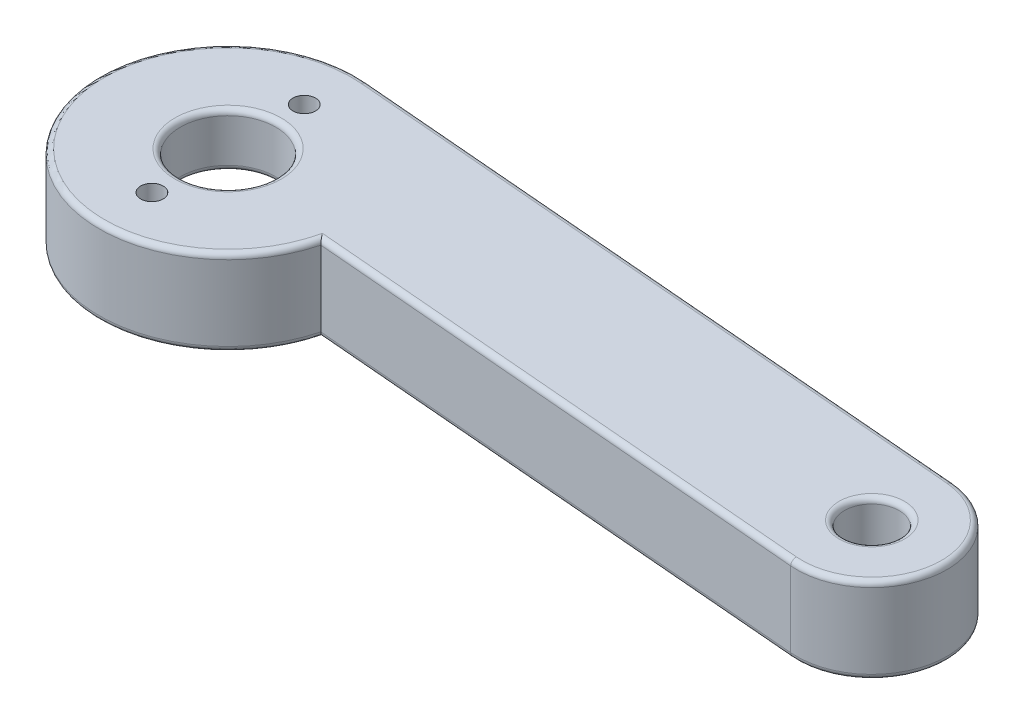
ISO-10303-21;
HEADER;
FILE_DESCRIPTION(('STEP AP214'),'2;1');
FILE_NAME('part.step','',(''),(''),'','','');
FILE_SCHEMA(('AUTOMOTIVE_DESIGN { 1 0 10303 214 1 1 1 1 }'));
ENDSEC;
DATA;
#1=APPLICATION_CONTEXT('core data for automotive mechanical design processes');
#2=APPLICATION_PROTOCOL_DEFINITION('international standard','automotive_design',2000,#1);
#3=PRODUCT_CONTEXT('',#1,'mechanical');
#4=PRODUCT('Part','Part','',(#3));
#5=PRODUCT_RELATED_PRODUCT_CATEGORY('part','',(#4));
#6=PRODUCT_DEFINITION_FORMATION('','',#4);
#7=PRODUCT_DEFINITION_CONTEXT('part definition',#1,'design');
#8=PRODUCT_DEFINITION('design','',#6,#7);
#9=PRODUCT_DEFINITION_SHAPE('','',#8);
#10=(LENGTH_UNIT() NAMED_UNIT(*) SI_UNIT(.MILLI.,.METRE.));
#11=(NAMED_UNIT(*) PLANE_ANGLE_UNIT() SI_UNIT($,.RADIAN.));
#12=(NAMED_UNIT(*) SI_UNIT($,.STERADIAN.) SOLID_ANGLE_UNIT());
#13=UNCERTAINTY_MEASURE_WITH_UNIT(LENGTH_MEASURE(1.E-05),#10,'distance_accuracy_value','');
#14=(GEOMETRIC_REPRESENTATION_CONTEXT(3) GLOBAL_UNCERTAINTY_ASSIGNED_CONTEXT((#13)) GLOBAL_UNIT_ASSIGNED_CONTEXT((#10,
#11,#12)) REPRESENTATION_CONTEXT('',''));
#15=CARTESIAN_POINT('',(0.,0.,0.));
#16=DIRECTION('',(0.,0.,1.));
#17=DIRECTION('',(1.,0.,0.));
#18=AXIS2_PLACEMENT_3D('',#15,#16,#17);
#19=CARTESIAN_POINT('',(0.,3.,0.));
#20=DIRECTION('',(0.,1.,0.));
#21=DIRECTION('',(0.,0.,1.));
#22=AXIS2_PLACEMENT_3D('',#19,#20,#21);
#23=PLANE('',#22);
#24=CARTESIAN_POINT('',(0.,3.,0.));
#25=DIRECTION('',(0.,1.,0.));
#26=DIRECTION('',(0.,0.,1.));
#27=AXIS2_PLACEMENT_3D('',#24,#25,#26);
#28=CIRCLE('',#27,4.95);
#29=CARTESIAN_POINT('',(0.,3.,4.95));
#30=VERTEX_POINT('',#29);
#31=EDGE_CURVE('E218',#30,#30,#28,.T.);
#32=ORIENTED_EDGE('',*,*,#31,.T.);
#33=EDGE_LOOP('',(#32));
#34=FACE_BOUND('',#33,.T.);
#35=CARTESIAN_POINT('',(0.,3.,-7.1));
#36=DIRECTION('',(0.,-1.,0.));
#37=DIRECTION('',(0.,0.,-1.));
#38=AXIS2_PLACEMENT_3D('',#35,#36,#37);
#39=CIRCLE('',#38,1.05);
#40=CARTESIAN_POINT('',(0.,3.,-8.15));
#41=VERTEX_POINT('',#40);
#42=EDGE_CURVE('E357',#41,#41,#39,.T.);
#43=ORIENTED_EDGE('',*,*,#42,.F.);
#44=EDGE_LOOP('',(#43));
#45=FACE_BOUND('',#44,.T.);
#46=CARTESIAN_POINT('',(0.,3.,7.1));
#47=DIRECTION('',(0.,-1.,0.));
#48=DIRECTION('',(0.,0.,1.));
#49=AXIS2_PLACEMENT_3D('',#46,#47,#48);
#50=CIRCLE('',#49,1.05);
#51=CARTESIAN_POINT('',(0.,3.,8.15));
#52=VERTEX_POINT('',#51);
#53=EDGE_CURVE('E286',#52,#52,#50,.T.);
#54=ORIENTED_EDGE('',*,*,#53,.F.);
#55=EDGE_LOOP('',(#54));
#56=FACE_BOUND('',#55,.T.);
#57=CARTESIAN_POINT('',(0.,3.,0.));
#58=DIRECTION('',(0.,1.,0.));
#59=DIRECTION('',(0.,0.,1.));
#60=AXIS2_PLACEMENT_3D('',#57,#58,#59);
#61=CIRCLE('',#60,10.5);
#62=CARTESIAN_POINT('',(0.,3.,10.5));
#63=VERTEX_POINT('',#62);
#64=EDGE_CURVE('E281',#63,#63,#61,.T.);
#65=ORIENTED_EDGE('',*,*,#64,.F.);
#66=EDGE_LOOP('',(#65));
#67=FACE_BOUND('',#66,.T.);
#68=ADVANCED_FACE('F39',(#34,#45,#56,#67),#23,.F.);
#69=CARTESIAN_POINT('',(0.,8.,0.));
#70=DIRECTION('',(0.,-1.,0.));
#71=DIRECTION('',(0.,0.,-1.));
#72=AXIS2_PLACEMENT_3D('',#69,#70,#71);
#73=CYLINDRICAL_SURFACE('',#72,12.);
#74=DIRECTION('',(0.,-1.,0.));
#75=VECTOR('',#74,1.);
#76=CARTESIAN_POINT('',(1.,8.,-11.9582607431014));
#77=LINE('',#76,#75);
#78=CARTESIAN_POINT('',(1.,7.5,-11.9582607431014));
#79=VERTEX_POINT('',#78);
#80=CARTESIAN_POINT('',(1.,0.5,-11.9582607431014));
#81=VERTEX_POINT('',#80);
#82=EDGE_CURVE('E288',#79,#81,#77,.T.);
#83=ORIENTED_EDGE('',*,*,#82,.T.);
#84=CARTESIAN_POINT('',(0.,0.5,0.));
#85=DIRECTION('',(0.,1.,0.));
#86=DIRECTION('',(0.,0.,1.));
#87=AXIS2_PLACEMENT_3D('',#84,#85,#86);
#88=CIRCLE('',#87,12.);
#89=CARTESIAN_POINT('',(11.624337437216,0.5,2.97905675436684));
#90=VERTEX_POINT('',#89);
#91=EDGE_CURVE('E164',#81,#90,#88,.T.);
#92=ORIENTED_EDGE('',*,*,#91,.T.);
#93=DIRECTION('',(0.,-1.,0.));
#94=VECTOR('',#93,1.);
#95=CARTESIAN_POINT('',(11.624337437216,8.,2.97905675436684));
#96=LINE('',#95,#94);
#97=CARTESIAN_POINT('',(11.624337437216,7.5,2.97905675436684));
#98=VERTEX_POINT('',#97);
#99=EDGE_CURVE('E132',#98,#90,#96,.T.);
#100=ORIENTED_EDGE('',*,*,#99,.F.);
#101=CARTESIAN_POINT('',(0.,7.5,0.));
#102=DIRECTION('',(0.,1.,0.));
#103=DIRECTION('',(0.,0.,1.));
#104=AXIS2_PLACEMENT_3D('',#101,#102,#103);
#105=CIRCLE('',#104,12.);
#106=EDGE_CURVE('E162',#98,#79,#105,.F.);
#107=ORIENTED_EDGE('',*,*,#106,.T.);
#108=EDGE_LOOP('',(#83,#92,#100,#107));
#109=FACE_BOUND('',#108,.T.);
#110=ADVANCED_FACE('F257',(#109),#73,.T.);
#111=CARTESIAN_POINT('',(59.4166666666667,8.,6.97565210014248));
#112=DIRECTION('',(0.0833333333333332,0.,-0.996521728591783));
#113=DIRECTION('',(-0.996521728591783,0.,-0.0833333333333332));
#114=AXIS2_PLACEMENT_3D('',#111,#112,#113);
#115=PLANE('',#114);
#116=DIRECTION('',(0.,-1.,0.));
#117=VECTOR('',#116,1.);
#118=CARTESIAN_POINT('',(59.4166666666667,8.,6.97565210014248));
#119=LINE('',#118,#117);
#120=CARTESIAN_POINT('',(59.4166666666667,7.5,6.97565210014248));
#121=VERTEX_POINT('',#120);
#122=CARTESIAN_POINT('',(59.4166666666667,0.5,6.97565210014248));
#123=VERTEX_POINT('',#122);
#124=EDGE_CURVE('E135',#121,#123,#119,.T.);
#125=ORIENTED_EDGE('',*,*,#124,.F.);
#126=DIRECTION('',(0.996521728591783,0.,0.0833333333333332));
#127=VECTOR('',#126,1.);
#128=CARTESIAN_POINT('',(11.624337437216,7.5,2.97905675436684));
#129=LINE('',#128,#127);
#130=EDGE_CURVE('E145',#121,#98,#129,.F.);
#131=ORIENTED_EDGE('',*,*,#130,.T.);
#132=ORIENTED_EDGE('',*,*,#99,.T.);
#133=DIRECTION('',(0.996521728591783,0.,0.0833333333333332));
#134=VECTOR('',#133,1.);
#135=CARTESIAN_POINT('',(59.4166666666667,0.5,6.97565210014248));
#136=LINE('',#135,#134);
#137=EDGE_CURVE('E142',#90,#123,#136,.T.);
#138=ORIENTED_EDGE('',*,*,#137,.T.);
#139=EDGE_LOOP('',(#125,#131,#132,#138));
#140=FACE_BOUND('',#139,.T.);
#141=ADVANCED_FACE('F263',(#140),#115,.F.);
#142=CARTESIAN_POINT('',(60.,8.,0.));
#143=DIRECTION('',(0.,-1.,0.));
#144=DIRECTION('',(0.,0.,-1.));
#145=AXIS2_PLACEMENT_3D('',#142,#143,#144);
#146=CYLINDRICAL_SURFACE('',#145,7.);
#147=DIRECTION('',(0.,-1.,0.));
#148=VECTOR('',#147,1.);
#149=CARTESIAN_POINT('',(60.5833333333333,8.,-6.97565210014248));
#150=LINE('',#149,#148);
#151=CARTESIAN_POINT('',(60.5833333333333,7.5,-6.97565210014248));
#152=VERTEX_POINT('',#151);
#153=CARTESIAN_POINT('',(60.5833333333333,0.5,-6.97565210014248));
#154=VERTEX_POINT('',#153);
#155=EDGE_CURVE('E297',#152,#154,#150,.T.);
#156=ORIENTED_EDGE('',*,*,#155,.F.);
#157=CARTESIAN_POINT('',(60.,7.5,0.));
#158=DIRECTION('',(0.,1.,0.));
#159=DIRECTION('',(0.,0.,1.));
#160=AXIS2_PLACEMENT_3D('',#157,#158,#159);
#161=CIRCLE('',#160,7.);
#162=EDGE_CURVE('E150',#152,#121,#161,.F.);
#163=ORIENTED_EDGE('',*,*,#162,.T.);
#164=ORIENTED_EDGE('',*,*,#124,.T.);
#165=CARTESIAN_POINT('',(60.,0.5,0.));
#166=DIRECTION('',(0.,1.,0.));
#167=DIRECTION('',(0.,0.,1.));
#168=AXIS2_PLACEMENT_3D('',#165,#166,#167);
#169=CIRCLE('',#168,7.);
#170=EDGE_CURVE('E148',#123,#154,#169,.T.);
#171=ORIENTED_EDGE('',*,*,#170,.T.);
#172=EDGE_LOOP('',(#156,#163,#164,#171));
#173=FACE_BOUND('',#172,.T.);
#174=ADVANCED_FACE('F252',(#173),#146,.T.);
#175=CARTESIAN_POINT('',(1.,8.,-11.9582607431014));
#176=DIRECTION('',(-0.0833333333333334,0.,0.996521728591783));
#177=DIRECTION('',(0.996521728591783,0.,0.0833333333333334));
#178=AXIS2_PLACEMENT_3D('',#175,#176,#177);
#179=PLANE('',#178);
#180=ORIENTED_EDGE('',*,*,#82,.F.);
#181=DIRECTION('',(-0.996521728591783,0.,-0.0833333333333334));
#182=VECTOR('',#181,1.);
#183=CARTESIAN_POINT('',(60.5833333333333,7.5,-6.97565210014248));
#184=LINE('',#183,#182);
#185=EDGE_CURVE('E123',#79,#152,#184,.F.);
#186=ORIENTED_EDGE('',*,*,#185,.T.);
#187=ORIENTED_EDGE('',*,*,#155,.T.);
#188=DIRECTION('',(-0.996521728591783,0.,-0.0833333333333334));
#189=VECTOR('',#188,1.);
#190=CARTESIAN_POINT('',(1.,0.5,-11.9582607431014));
#191=LINE('',#190,#189);
#192=EDGE_CURVE('E152',#154,#81,#191,.T.);
#193=ORIENTED_EDGE('',*,*,#192,.T.);
#194=EDGE_LOOP('',(#180,#186,#187,#193));
#195=FACE_BOUND('',#194,.T.);
#196=ADVANCED_FACE('F242',(#195),#179,.F.);
#197=CARTESIAN_POINT('',(0.,8.,0.));
#198=DIRECTION('',(0.,1.,0.));
#199=DIRECTION('',(0.,0.,1.));
#200=AXIS2_PLACEMENT_3D('',#197,#198,#199);
#201=PLANE('',#200);
#202=CARTESIAN_POINT('',(0.,8.,0.));
#203=DIRECTION('',(0.,1.,0.));
#204=DIRECTION('',(0.,0.,1.));
#205=AXIS2_PLACEMENT_3D('',#202,#203,#204);
#206=CIRCLE('',#205,4.95);
#207=CARTESIAN_POINT('',(0.,8.,4.95));
#208=VERTEX_POINT('',#207);
#209=EDGE_CURVE('E224',#208,#208,#206,.F.);
#210=ORIENTED_EDGE('',*,*,#209,.T.);
#211=EDGE_LOOP('',(#210));
#212=FACE_BOUND('',#211,.T.);
#213=CARTESIAN_POINT('',(60.,8.,0.));
#214=DIRECTION('',(0.,1.,0.));
#215=DIRECTION('',(0.,0.,1.));
#216=AXIS2_PLACEMENT_3D('',#213,#214,#215);
#217=CIRCLE('',#216,3.05);
#218=CARTESIAN_POINT('',(60.,8.,3.05));
#219=VERTEX_POINT('',#218);
#220=EDGE_CURVE('E221',#219,#219,#217,.F.);
#221=ORIENTED_EDGE('',*,*,#220,.T.);
#222=EDGE_LOOP('',(#221));
#223=FACE_BOUND('',#222,.T.);
#224=CARTESIAN_POINT('',(0.,8.,0.));
#225=DIRECTION('',(0.,1.,0.));
#226=DIRECTION('',(0.,0.,1.));
#227=AXIS2_PLACEMENT_3D('',#224,#225,#226);
#228=CIRCLE('',#227,11.5);
#229=CARTESIAN_POINT('',(0.958333333333333,8.,-11.4599998788055));
#230=VERTEX_POINT('',#229);
#231=CARTESIAN_POINT('',(11.2370958551766,8.,2.4449287804703));
#232=VERTEX_POINT('',#231);
#233=EDGE_CURVE('E111',#230,#232,#228,.T.);
#234=ORIENTED_EDGE('',*,*,#233,.T.);
#235=DIRECTION('',(0.996521728591783,0.,0.0833333333333332));
#236=VECTOR('',#235,1.);
#237=CARTESIAN_POINT('',(59.4583333333333,8.,6.47739123584659));
#238=LINE('',#237,#236);
#239=CARTESIAN_POINT('',(59.4583333333333,8.,6.47739123584659));
#240=VERTEX_POINT('',#239);
#241=EDGE_CURVE('E140',#232,#240,#238,.T.);
#242=ORIENTED_EDGE('',*,*,#241,.T.);
#243=CARTESIAN_POINT('',(60.,8.,0.));
#244=DIRECTION('',(0.,1.,0.));
#245=DIRECTION('',(0.,0.,1.));
#246=AXIS2_PLACEMENT_3D('',#243,#244,#245);
#247=CIRCLE('',#246,6.5);
#248=CARTESIAN_POINT('',(60.5416666666667,8.,-6.47739123584659));
#249=VERTEX_POINT('',#248);
#250=EDGE_CURVE('E114',#240,#249,#247,.T.);
#251=ORIENTED_EDGE('',*,*,#250,.T.);
#252=DIRECTION('',(-0.996521728591783,0.,-0.0833333333333334));
#253=VECTOR('',#252,1.);
#254=CARTESIAN_POINT('',(0.958333333333333,8.,-11.4599998788055));
#255=LINE('',#254,#253);
#256=EDGE_CURVE('E105',#249,#230,#255,.T.);
#257=ORIENTED_EDGE('',*,*,#256,.T.);
#258=EDGE_LOOP('',(#234,#242,#251,#257));
#259=FACE_BOUND('',#258,.T.);
#260=CARTESIAN_POINT('',(0.,8.,-7.1));
#261=DIRECTION('',(0.,-1.,0.));
#262=DIRECTION('',(0.,0.,-1.));
#263=AXIS2_PLACEMENT_3D('',#260,#261,#262);
#264=CIRCLE('',#263,1.05);
#265=CARTESIAN_POINT('',(0.,8.,-8.15));
#266=VERTEX_POINT('',#265);
#267=EDGE_CURVE('E126',#266,#266,#264,.T.);
#268=ORIENTED_EDGE('',*,*,#267,.T.);
#269=EDGE_LOOP('',(#268));
#270=FACE_BOUND('',#269,.T.);
#271=CARTESIAN_POINT('',(0.,8.,7.1));
#272=DIRECTION('',(0.,-1.,0.));
#273=DIRECTION('',(0.,0.,1.));
#274=AXIS2_PLACEMENT_3D('',#271,#272,#273);
#275=CIRCLE('',#274,1.05);
#276=CARTESIAN_POINT('',(0.,8.,8.15));
#277=VERTEX_POINT('',#276);
#278=EDGE_CURVE('E291',#277,#277,#275,.T.);
#279=ORIENTED_EDGE('',*,*,#278,.T.);
#280=EDGE_LOOP('',(#279));
#281=FACE_BOUND('',#280,.T.);
#282=ADVANCED_FACE('F107',(#212,#223,#259,#270,#281),#201,.T.);
#283=CARTESIAN_POINT('',(0.,0.,0.));
#284=DIRECTION('',(0.,1.,0.));
#285=DIRECTION('',(0.,0.,1.));
#286=AXIS2_PLACEMENT_3D('',#283,#284,#285);
#287=PLANE('',#286);
#288=CARTESIAN_POINT('',(60.,0.,0.));
#289=DIRECTION('',(0.,1.,0.));
#290=DIRECTION('',(0.,0.,1.));
#291=AXIS2_PLACEMENT_3D('',#288,#289,#290);
#292=CIRCLE('',#291,3.05);
#293=CARTESIAN_POINT('',(60.,0.,3.05));
#294=VERTEX_POINT('',#293);
#295=EDGE_CURVE('E11',#294,#294,#292,.T.);
#296=ORIENTED_EDGE('',*,*,#295,.T.);
#297=EDGE_LOOP('',(#296));
#298=FACE_BOUND('',#297,.T.);
#299=CARTESIAN_POINT('',(60.,0.,0.));
#300=DIRECTION('',(0.,1.,0.));
#301=DIRECTION('',(0.,0.,1.));
#302=AXIS2_PLACEMENT_3D('',#299,#300,#301);
#303=CIRCLE('',#302,6.5);
#304=CARTESIAN_POINT('',(60.5416666666667,0.,-6.47739123584659));
#305=VERTEX_POINT('',#304);
#306=CARTESIAN_POINT('',(59.4583333333333,0.,6.47739123584659));
#307=VERTEX_POINT('',#306);
#308=EDGE_CURVE('E54',#305,#307,#303,.F.);
#309=ORIENTED_EDGE('',*,*,#308,.T.);
#310=DIRECTION('',(0.996521728591783,0.,0.0833333333333332));
#311=VECTOR('',#310,1.);
#312=CARTESIAN_POINT('',(-0.125000000000001,0.,1.49478259288768));
#313=LINE('',#312,#311);
#314=CARTESIAN_POINT('',(11.2370958551766,0.,2.4449287804703));
#315=VERTEX_POINT('',#314);
#316=EDGE_CURVE('E160',#307,#315,#313,.F.);
#317=ORIENTED_EDGE('',*,*,#316,.T.);
#318=CARTESIAN_POINT('',(0.,0.,0.));
#319=DIRECTION('',(0.,1.,0.));
#320=DIRECTION('',(0.,0.,1.));
#321=AXIS2_PLACEMENT_3D('',#318,#319,#320);
#322=CIRCLE('',#321,11.5);
#323=CARTESIAN_POINT('',(0.958333333333333,0.,-11.4599998788055));
#324=VERTEX_POINT('',#323);
#325=EDGE_CURVE('E157',#315,#324,#322,.F.);
#326=ORIENTED_EDGE('',*,*,#325,.T.);
#327=DIRECTION('',(-0.996521728591783,0.,-0.0833333333333334));
#328=VECTOR('',#327,1.);
#329=CARTESIAN_POINT('',(0.958333333333333,0.,-11.4599998788055));
#330=LINE('',#329,#328);
#331=EDGE_CURVE('E155',#324,#305,#330,.F.);
#332=ORIENTED_EDGE('',*,*,#331,.T.);
#333=EDGE_LOOP('',(#309,#317,#326,#332));
#334=FACE_BOUND('',#333,.T.);
#335=CARTESIAN_POINT('',(0.,0.,0.));
#336=DIRECTION('',(0.,1.,0.));
#337=DIRECTION('',(0.,0.,1.));
#338=AXIS2_PLACEMENT_3D('',#335,#336,#337);
#339=CIRCLE('',#338,10.5);
#340=CARTESIAN_POINT('',(0.,0.,10.5));
#341=VERTEX_POINT('',#340);
#342=EDGE_CURVE('E284',#341,#341,#339,.T.);
#343=ORIENTED_EDGE('',*,*,#342,.T.);
#344=EDGE_LOOP('',(#343));
#345=FACE_BOUND('',#344,.T.);
#346=ADVANCED_FACE('F241',(#298,#334,#345),#287,.F.);
#347=CARTESIAN_POINT('',(0.,3.,0.));
#348=DIRECTION('',(0.,-1.,0.));
#349=DIRECTION('',(0.,0.,-1.));
#350=AXIS2_PLACEMENT_3D('',#347,#348,#349);
#351=CYLINDRICAL_SURFACE('',#350,10.5);
#352=ORIENTED_EDGE('',*,*,#64,.T.);
#353=EDGE_LOOP('',(#352));
#354=FACE_BOUND('',#353,.T.);
#355=ORIENTED_EDGE('',*,*,#342,.F.);
#356=EDGE_LOOP('',(#355));
#357=FACE_BOUND('',#356,.T.);
#358=ADVANCED_FACE('F249',(#354,#357),#351,.F.);
#359=CARTESIAN_POINT('',(0.,8.,7.1));
#360=DIRECTION('',(0.,-1.,0.));
#361=DIRECTION('',(0.,0.,-1.));
#362=AXIS2_PLACEMENT_3D('',#359,#360,#361);
#363=CYLINDRICAL_SURFACE('',#362,1.05);
#364=ORIENTED_EDGE('',*,*,#278,.F.);
#365=EDGE_LOOP('',(#364));
#366=FACE_BOUND('',#365,.T.);
#367=ORIENTED_EDGE('',*,*,#53,.T.);
#368=EDGE_LOOP('',(#367));
#369=FACE_BOUND('',#368,.T.);
#370=ADVANCED_FACE('F270',(#366,#369),#363,.F.);
#371=CARTESIAN_POINT('',(0.,8.,-7.1));
#372=DIRECTION('',(0.,-1.,0.));
#373=DIRECTION('',(0.,0.,-1.));
#374=AXIS2_PLACEMENT_3D('',#371,#372,#373);
#375=CYLINDRICAL_SURFACE('',#374,1.05);
#376=ORIENTED_EDGE('',*,*,#267,.F.);
#377=EDGE_LOOP('',(#376));
#378=FACE_BOUND('',#377,.T.);
#379=ORIENTED_EDGE('',*,*,#42,.T.);
#380=EDGE_LOOP('',(#379));
#381=FACE_BOUND('',#380,.T.);
#382=ADVANCED_FACE('F275',(#378,#381),#375,.F.);
#383=CARTESIAN_POINT('',(0.,8.,0.));
#384=DIRECTION('',(0.,-1.,0.));
#385=DIRECTION('',(0.,0.,-1.));
#386=AXIS2_PLACEMENT_3D('',#383,#384,#385);
#387=CYLINDRICAL_SURFACE('',#386,4.45);
#388=CARTESIAN_POINT('',(0.,3.5,0.));
#389=DIRECTION('',(0.,1.,0.));
#390=DIRECTION('',(0.,0.,1.));
#391=AXIS2_PLACEMENT_3D('',#388,#389,#390);
#392=CIRCLE('',#391,4.45);
#393=CARTESIAN_POINT('',(0.,3.5,4.45));
#394=VERTEX_POINT('',#393);
#395=EDGE_CURVE('E215',#394,#394,#392,.F.);
#396=ORIENTED_EDGE('',*,*,#395,.T.);
#397=EDGE_LOOP('',(#396));
#398=FACE_BOUND('',#397,.T.);
#399=CARTESIAN_POINT('',(0.,7.5,0.));
#400=DIRECTION('',(0.,1.,0.));
#401=DIRECTION('',(0.,0.,1.));
#402=AXIS2_PLACEMENT_3D('',#399,#400,#401);
#403=CIRCLE('',#402,4.45);
#404=CARTESIAN_POINT('',(0.,7.5,4.45));
#405=VERTEX_POINT('',#404);
#406=EDGE_CURVE('E166',#405,#405,#403,.T.);
#407=ORIENTED_EDGE('',*,*,#406,.T.);
#408=EDGE_LOOP('',(#407));
#409=FACE_BOUND('',#408,.T.);
#410=ADVANCED_FACE('F267',(#398,#409),#387,.F.);
#411=CARTESIAN_POINT('',(60.,8.,0.));
#412=DIRECTION('',(0.,-1.,0.));
#413=DIRECTION('',(0.,0.,-1.));
#414=AXIS2_PLACEMENT_3D('',#411,#412,#413);
#415=CYLINDRICAL_SURFACE('',#414,2.55);
#416=CARTESIAN_POINT('',(60.,7.5,0.));
#417=DIRECTION('',(0.,1.,0.));
#418=DIRECTION('',(0.,0.,1.));
#419=AXIS2_PLACEMENT_3D('',#416,#417,#418);
#420=CIRCLE('',#419,2.55);
#421=CARTESIAN_POINT('',(60.,7.5,2.55));
#422=VERTEX_POINT('',#421);
#423=EDGE_CURVE('E47',#422,#422,#420,.T.);
#424=ORIENTED_EDGE('',*,*,#423,.T.);
#425=EDGE_LOOP('',(#424));
#426=FACE_BOUND('',#425,.T.);
#427=CARTESIAN_POINT('',(60.,0.5,0.));
#428=DIRECTION('',(0.,1.,0.));
#429=DIRECTION('',(0.,0.,1.));
#430=AXIS2_PLACEMENT_3D('',#427,#428,#429);
#431=CIRCLE('',#430,2.55);
#432=CARTESIAN_POINT('',(60.,0.5,2.55));
#433=VERTEX_POINT('',#432);
#434=EDGE_CURVE('E227',#433,#433,#431,.F.);
#435=ORIENTED_EDGE('',*,*,#434,.T.);
#436=EDGE_LOOP('',(#435));
#437=FACE_BOUND('',#436,.T.);
#438=ADVANCED_FACE('F189',(#426,#437),#415,.F.);
#439=CARTESIAN_POINT('',(0.958333333333333,7.5,-11.4599998788055));
#440=DIRECTION('',(0.996521728591783,0.,0.0833333333333334));
#441=DIRECTION('',(0.0833333333333334,0.,-0.996521728591783));
#442=AXIS2_PLACEMENT_3D('',#439,#440,#441);
#443=CYLINDRICAL_SURFACE('',#442,0.5);
#444=CARTESIAN_POINT('',(60.5416666666667,7.5,-6.47739123584659));
#445=DIRECTION('',(0.996521728591783,0.,0.083333333333338));
#446=DIRECTION('',(0.083333333333338,0.,-0.996521728591783));
#447=AXIS2_PLACEMENT_3D('',#444,#445,#446);
#448=CIRCLE('',#447,0.5);
#449=EDGE_CURVE('E127',#152,#249,#448,.T.);
#450=ORIENTED_EDGE('',*,*,#449,.F.);
#451=ORIENTED_EDGE('',*,*,#185,.F.);
#452=CARTESIAN_POINT('',(0.958333333333333,7.5,-11.4599998788055));
#453=DIRECTION('',(-0.996521728591783,0.,-0.0833333333333332));
#454=DIRECTION('',(-0.0833333333333332,0.,0.996521728591783));
#455=AXIS2_PLACEMENT_3D('',#452,#453,#454);
#456=CIRCLE('',#455,0.5);
#457=EDGE_CURVE('E121',#230,#79,#456,.T.);
#458=ORIENTED_EDGE('',*,*,#457,.F.);
#459=ORIENTED_EDGE('',*,*,#256,.F.);
#460=EDGE_LOOP('',(#450,#451,#458,#459));
#461=FACE_BOUND('',#460,.T.);
#462=ADVANCED_FACE('F122',(#461),#443,.T.);
#463=CARTESIAN_POINT('',(0.,7.5,0.));
#464=DIRECTION('',(0.,1.,0.));
#465=DIRECTION('',(0.,0.,1.));
#466=AXIS2_PLACEMENT_3D('',#463,#464,#465);
#467=TOROIDAL_SURFACE('',#466,11.5,0.5);
#468=ORIENTED_EDGE('',*,*,#457,.T.);
#469=ORIENTED_EDGE('',*,*,#106,.F.);
#470=CARTESIAN_POINT('',(11.624337437216,7.5,2.97905675436684));
#471=CARTESIAN_POINT('',(11.624364400957,7.52345562001356,2.9790958130321));
#472=CARTESIAN_POINT('',(11.6230868878862,7.54686596570533,2.97729852003296));
#473=CARTESIAN_POINT('',(11.6181522765029,7.5927653386556,2.97036264065188));
#474=CARTESIAN_POINT('',(11.6145119864081,7.61525968992064,2.96524765569223));
#475=CARTESIAN_POINT('',(11.6050846994544,7.65880268308405,2.95201248489779));
#476=CARTESIAN_POINT('',(11.5993018947738,7.6798540537153,2.94389816781612));
#477=CARTESIAN_POINT('',(11.5859012743351,7.72018047966945,2.92511618907128));
#478=CARTESIAN_POINT('',(11.5782802141341,7.73945231007849,2.91444401310964));
#479=CARTESIAN_POINT('',(11.5587698878545,7.78195419568809,2.88716011288401));
#480=CARTESIAN_POINT('',(11.5463009021345,7.80440509402426,2.86974887684406));
#481=CARTESIAN_POINT('',(11.5193658698527,7.84552228838147,2.83221933327641));
#482=CARTESIAN_POINT('',(11.5048965562135,7.86418226709781,2.81209659852589));
#483=CARTESIAN_POINT('',(11.4699791459766,7.90274331196973,2.76365260541725));
#484=CARTESIAN_POINT('',(11.4490327318415,7.92136303059285,2.73467290917511));
#485=CARTESIAN_POINT('',(11.4055662224425,7.95256916034186,2.67474027708661));
#486=CARTESIAN_POINT('',(11.3830447967751,7.96515039851618,2.64378567503181));
#487=CARTESIAN_POINT('',(11.3404670978705,7.98313830495469,2.58547120238261));
#488=CARTESIAN_POINT('',(11.3205368702635,7.98932923122483,2.55825413280126));
#489=CARTESIAN_POINT('',(11.2803347926448,7.99766369538734,2.50352177050439));
#490=CARTESIAN_POINT('',(11.2600636943231,7.99981519550084,2.47600717221481));
#491=CARTESIAN_POINT('',(11.2388756332535,7.99999619825264,2.44733659406193));
#492=CARTESIAN_POINT('',(11.2379857634416,7.99999999836867,2.44613263165858));
#493=CARTESIAN_POINT('',(11.2370958551766,8.,2.4449287804703));
#494=B_SPLINE_CURVE_WITH_KNOTS('',3,(#470,#471,#472,#473,#474,#475,#476,#477,#478,#479,#480,
#481,#482,#483,#484,#485,#486,#487,#488,#489,#490,#491,#492,#493),.UNSPECIFIED.,.F.,.F.,(4,2,2,
2,2,2,2,2,2,2,2,4),(0.,0.0701917010019096,0.139889468426027,0.209451574913979,0.279137365678248,
0.37171307404214,0.464441810340607,0.584748376435319,0.705157821745911,0.807816276028559,
0.910272164167701,0.914763540856439),.UNSPECIFIED.);
#495=EDGE_CURVE('E130',#232,#98,#494,.F.);
#496=ORIENTED_EDGE('',*,*,#495,.F.);
#497=ORIENTED_EDGE('',*,*,#233,.F.);
#498=EDGE_LOOP('',(#468,#469,#496,#497));
#499=FACE_BOUND('',#498,.T.);
#500=ADVANCED_FACE('F129',(#499),#467,.T.);
#501=CARTESIAN_POINT('',(60.,7.5,0.));
#502=DIRECTION('',(0.,1.,0.));
#503=DIRECTION('',(0.,0.,1.));
#504=AXIS2_PLACEMENT_3D('',#501,#502,#503);
#505=TOROIDAL_SURFACE('',#504,6.5,0.5);
#506=ORIENTED_EDGE('',*,*,#449,.T.);
#507=ORIENTED_EDGE('',*,*,#250,.F.);
#508=CARTESIAN_POINT('',(59.4583333333333,7.5,6.47739123584659));
#509=DIRECTION('',(-0.996521728591783,0.,-0.083333333333338));
#510=DIRECTION('',(-0.083333333333338,0.,0.996521728591783));
#511=AXIS2_PLACEMENT_3D('',#508,#509,#510);
#512=CIRCLE('',#511,0.5);
#513=EDGE_CURVE('E167',#121,#240,#512,.T.);
#514=ORIENTED_EDGE('',*,*,#513,.F.);
#515=ORIENTED_EDGE('',*,*,#162,.F.);
#516=EDGE_LOOP('',(#506,#507,#514,#515));
#517=FACE_BOUND('',#516,.T.);
#518=ADVANCED_FACE('F183',(#517),#505,.T.);
#519=CARTESIAN_POINT('',(-0.125000000000001,7.5,1.49478259288769));
#520=DIRECTION('',(-0.996521728591783,0.,-0.0833333333333332));
#521=DIRECTION('',(-0.0833333333333332,0.,0.996521728591783));
#522=AXIS2_PLACEMENT_3D('',#519,#520,#521);
#523=CYLINDRICAL_SURFACE('',#522,0.5);
#524=ORIENTED_EDGE('',*,*,#495,.T.);
#525=ORIENTED_EDGE('',*,*,#130,.F.);
#526=ORIENTED_EDGE('',*,*,#513,.T.);
#527=ORIENTED_EDGE('',*,*,#241,.F.);
#528=EDGE_LOOP('',(#524,#525,#526,#527));
#529=FACE_BOUND('',#528,.T.);
#530=ADVANCED_FACE('F177',(#529),#523,.T.);
#531=CARTESIAN_POINT('',(0.958333333333333,0.5,-11.4599998788055));
#532=DIRECTION('',(-0.996521728591783,0.,-0.0833333333333334));
#533=DIRECTION('',(-0.0833333333333334,0.,0.996521728591783));
#534=AXIS2_PLACEMENT_3D('',#531,#532,#533);
#535=CYLINDRICAL_SURFACE('',#534,0.5);
#536=CARTESIAN_POINT('',(60.5416666666667,0.5,-6.47739123584659));
#537=DIRECTION('',(0.996521728591783,0.,0.0833333333333379));
#538=DIRECTION('',(0.0833333333333379,0.,-0.996521728591783));
#539=AXIS2_PLACEMENT_3D('',#536,#537,#538);
#540=CIRCLE('',#539,0.5);
#541=EDGE_CURVE('E207',#305,#154,#540,.T.);
#542=ORIENTED_EDGE('',*,*,#541,.F.);
#543=ORIENTED_EDGE('',*,*,#331,.F.);
#544=CARTESIAN_POINT('',(0.958333333333333,0.5,-11.4599998788055));
#545=DIRECTION('',(-0.996521728591783,0.,-0.0833333333333332));
#546=DIRECTION('',(-0.0833333333333332,0.,0.996521728591783));
#547=AXIS2_PLACEMENT_3D('',#544,#545,#546);
#548=CIRCLE('',#547,0.5);
#549=EDGE_CURVE('E169',#81,#324,#548,.T.);
#550=ORIENTED_EDGE('',*,*,#549,.F.);
#551=ORIENTED_EDGE('',*,*,#192,.F.);
#552=EDGE_LOOP('',(#542,#543,#550,#551));
#553=FACE_BOUND('',#552,.T.);
#554=ADVANCED_FACE('F195',(#553),#535,.T.);
#555=CARTESIAN_POINT('',(0.,0.5,0.));
#556=DIRECTION('',(0.,1.,0.));
#557=DIRECTION('',(0.,0.,1.));
#558=AXIS2_PLACEMENT_3D('',#555,#556,#557);
#559=TOROIDAL_SURFACE('',#558,11.5,0.5);
#560=ORIENTED_EDGE('',*,*,#549,.T.);
#561=ORIENTED_EDGE('',*,*,#325,.F.);
#562=CARTESIAN_POINT('',(11.624337437216,0.5,2.97905675436684));
#563=CARTESIAN_POINT('',(11.624364400957,0.476544379986439,2.9790958130321));
#564=CARTESIAN_POINT('',(11.6230868878862,0.453134034294668,2.97729852003296));
#565=CARTESIAN_POINT('',(11.6181522765029,0.407234661344403,2.97036264065188));
#566=CARTESIAN_POINT('',(11.6145119864081,0.38474031007936,2.96524765569223));
#567=CARTESIAN_POINT('',(11.6050846994544,0.341197316915949,2.95201248489779));
#568=CARTESIAN_POINT('',(11.5993018947738,0.320145946284697,2.94389816781612));
#569=CARTESIAN_POINT('',(11.5859012743351,0.279819520330551,2.92511618907128));
#570=CARTESIAN_POINT('',(11.5782802141341,0.260547689921507,2.91444401310964));
#571=CARTESIAN_POINT('',(11.5587698878545,0.218045804311912,2.88716011288401));
#572=CARTESIAN_POINT('',(11.5463009021345,0.195594905975739,2.86974887684406));
#573=CARTESIAN_POINT('',(11.5193658698527,0.154477711618527,2.83221933327641));
#574=CARTESIAN_POINT('',(11.5048965562135,0.135817732902185,2.81209659852589));
#575=CARTESIAN_POINT('',(11.4699791459766,0.0972566880302664,2.76365260541724));
#576=CARTESIAN_POINT('',(11.4490327318415,0.0786369694071431,2.73467290917511));
#577=CARTESIAN_POINT('',(11.4055662224425,0.047430839658137,2.67474027708661));
#578=CARTESIAN_POINT('',(11.3830447967751,0.0348496014838195,2.64378567503181));
#579=CARTESIAN_POINT('',(11.3404670978705,0.0168616950453058,2.5854712023826));
#580=CARTESIAN_POINT('',(11.3205368702635,0.0106707687751688,2.55825413280125));
#581=CARTESIAN_POINT('',(11.2803347926448,0.00233630461266485,2.50352177050441));
#582=CARTESIAN_POINT('',(11.260063694323,0.000184804499165641,2.47600717221487));
#583=CARTESIAN_POINT('',(11.2388756332535,3.80174736515486E-06,2.44733659406194));
#584=CARTESIAN_POINT('',(11.2379857634416,1.6313340334363E-09,2.44613263165858));
#585=CARTESIAN_POINT('',(11.2370958551766,0.,2.4449287804703));
#586=B_SPLINE_CURVE_WITH_KNOTS('',3,(#562,#563,#564,#565,#566,#567,#568,#569,#570,#571,#572,
#573,#574,#575,#576,#577,#578,#579,#580,#581,#582,#583,#584,#585),.UNSPECIFIED.,.F.,.F.,(4,2,2,
2,2,2,2,2,2,2,2,4),(0.,0.0701917010019094,0.139889468426027,0.20945157491398,0.279137365678251,
0.371713074042148,0.464441810340613,0.584748376435328,0.705157821745918,0.807816276028558,
0.910272164167691,0.914763540856433),.UNSPECIFIED.);
#587=EDGE_CURVE('E61',#90,#315,#586,.T.);
#588=ORIENTED_EDGE('',*,*,#587,.F.);
#589=ORIENTED_EDGE('',*,*,#91,.F.);
#590=EDGE_LOOP('',(#560,#561,#588,#589));
#591=FACE_BOUND('',#590,.T.);
#592=ADVANCED_FACE('F190',(#591),#559,.T.);
#593=CARTESIAN_POINT('',(60.,0.5,0.));
#594=DIRECTION('',(0.,1.,0.));
#595=DIRECTION('',(0.,0.,1.));
#596=AXIS2_PLACEMENT_3D('',#593,#594,#595);
#597=TOROIDAL_SURFACE('',#596,6.5,0.5);
#598=ORIENTED_EDGE('',*,*,#541,.T.);
#599=ORIENTED_EDGE('',*,*,#170,.F.);
#600=CARTESIAN_POINT('',(59.4583333333333,0.5,6.47739123584659));
#601=DIRECTION('',(-0.996521728591783,0.,-0.0833333333333379));
#602=DIRECTION('',(-0.0833333333333379,0.,0.996521728591783));
#603=AXIS2_PLACEMENT_3D('',#600,#601,#602);
#604=CIRCLE('',#603,0.5);
#605=EDGE_CURVE('E208',#307,#123,#604,.T.);
#606=ORIENTED_EDGE('',*,*,#605,.F.);
#607=ORIENTED_EDGE('',*,*,#308,.F.);
#608=EDGE_LOOP('',(#598,#599,#606,#607));
#609=FACE_BOUND('',#608,.T.);
#610=ADVANCED_FACE('F194',(#609),#597,.T.);
#611=CARTESIAN_POINT('',(59.4583333333333,0.5,6.47739123584659));
#612=DIRECTION('',(0.996521728591783,0.,0.0833333333333332));
#613=DIRECTION('',(0.0833333333333332,0.,-0.996521728591783));
#614=AXIS2_PLACEMENT_3D('',#611,#612,#613);
#615=CYLINDRICAL_SURFACE('',#614,0.5);
#616=ORIENTED_EDGE('',*,*,#587,.T.);
#617=ORIENTED_EDGE('',*,*,#316,.F.);
#618=ORIENTED_EDGE('',*,*,#605,.T.);
#619=ORIENTED_EDGE('',*,*,#137,.F.);
#620=EDGE_LOOP('',(#616,#617,#618,#619));
#621=FACE_BOUND('',#620,.T.);
#622=ADVANCED_FACE('F197',(#621),#615,.T.);
#623=CARTESIAN_POINT('',(0.,3.5,0.));
#624=DIRECTION('',(0.,1.,0.));
#625=DIRECTION('',(0.,0.,1.));
#626=AXIS2_PLACEMENT_3D('',#623,#624,#625);
#627=TOROIDAL_SURFACE('',#626,4.95,0.5);
#628=ORIENTED_EDGE('',*,*,#31,.F.);
#629=EDGE_LOOP('',(#628));
#630=FACE_BOUND('',#629,.T.);
#631=ORIENTED_EDGE('',*,*,#395,.F.);
#632=EDGE_LOOP('',(#631));
#633=FACE_BOUND('',#632,.T.);
#634=ADVANCED_FACE('F320',(#630,#633),#627,.T.);
#635=CARTESIAN_POINT('',(0.,7.5,0.));
#636=DIRECTION('',(0.,1.,0.));
#637=DIRECTION('',(0.,0.,1.));
#638=AXIS2_PLACEMENT_3D('',#635,#636,#637);
#639=TOROIDAL_SURFACE('',#638,4.95,0.5);
#640=ORIENTED_EDGE('',*,*,#406,.F.);
#641=EDGE_LOOP('',(#640));
#642=FACE_BOUND('',#641,.T.);
#643=ORIENTED_EDGE('',*,*,#209,.F.);
#644=EDGE_LOOP('',(#643));
#645=FACE_BOUND('',#644,.T.);
#646=ADVANCED_FACE('F237',(#642,#645),#639,.T.);
#647=CARTESIAN_POINT('',(60.,7.5,0.));
#648=DIRECTION('',(0.,1.,0.));
#649=DIRECTION('',(0.,0.,1.));
#650=AXIS2_PLACEMENT_3D('',#647,#648,#649);
#651=TOROIDAL_SURFACE('',#650,3.05,0.5);
#652=ORIENTED_EDGE('',*,*,#423,.F.);
#653=EDGE_LOOP('',(#652));
#654=FACE_BOUND('',#653,.T.);
#655=ORIENTED_EDGE('',*,*,#220,.F.);
#656=EDGE_LOOP('',(#655));
#657=FACE_BOUND('',#656,.T.);
#658=ADVANCED_FACE('F234',(#654,#657),#651,.T.);
#659=CARTESIAN_POINT('',(60.,0.5,0.));
#660=DIRECTION('',(0.,1.,0.));
#661=DIRECTION('',(0.,0.,1.));
#662=AXIS2_PLACEMENT_3D('',#659,#660,#661);
#663=TOROIDAL_SURFACE('',#662,3.05,0.5);
#664=ORIENTED_EDGE('',*,*,#295,.F.);
#665=EDGE_LOOP('',(#664));
#666=FACE_BOUND('',#665,.T.);
#667=ORIENTED_EDGE('',*,*,#434,.F.);
#668=EDGE_LOOP('',(#667));
#669=FACE_BOUND('',#668,.T.);
#670=ADVANCED_FACE('F41',(#666,#669),#663,.T.);
#671=CLOSED_SHELL('',(#68,#110,#141,#174,#196,#282,#346,#358,#370,#382,#410,#438,#462,#500,#518,
#530,#554,#592,#610,#622,#634,#646,#658,#670));
#672=MANIFOLD_SOLID_BREP('B2',#671);
#673=ADVANCED_BREP_SHAPE_REPRESENTATION('',(#18,#672),#14);
#674=SHAPE_DEFINITION_REPRESENTATION(#9,#673);
ENDSEC;
END-ISO-10303-21;
